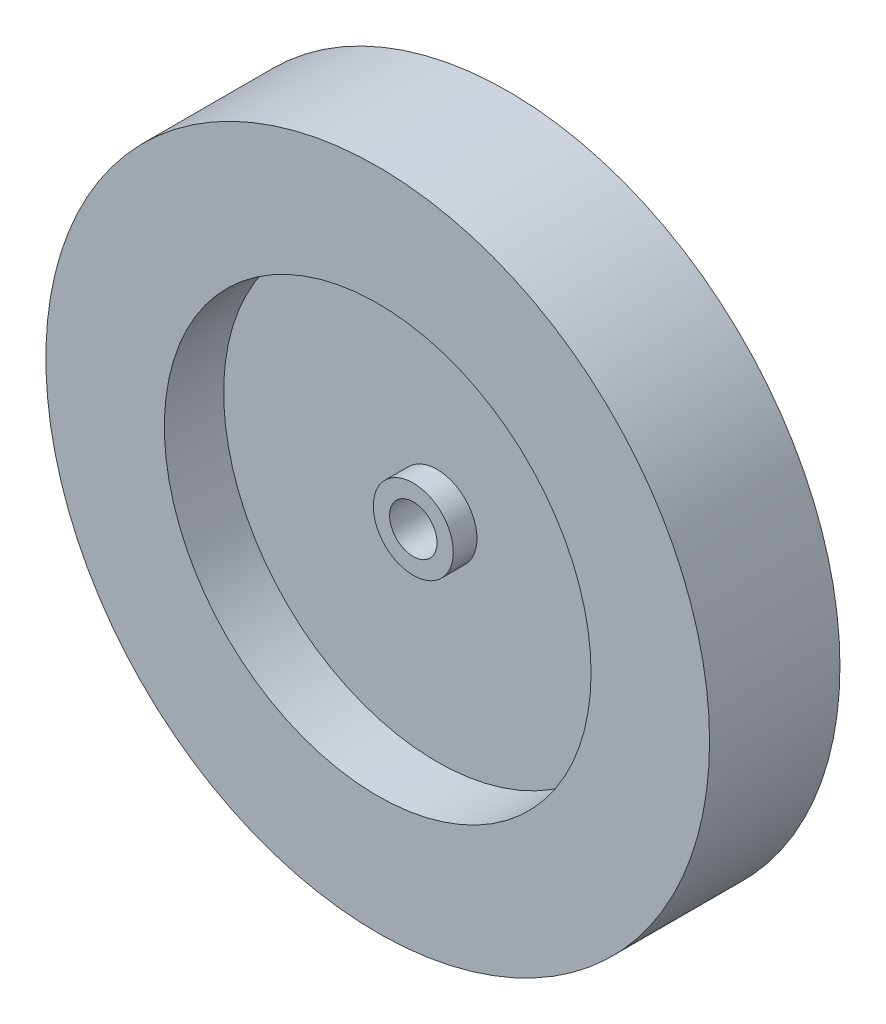
ISO-10303-21;
HEADER;
FILE_DESCRIPTION(('STEP AP214'),'2;1');
FILE_NAME('part.step','',(''),(''),'','','');
FILE_SCHEMA(('AUTOMOTIVE_DESIGN { 1 0 10303 214 1 1 1 1 }'));
ENDSEC;
DATA;
#1=APPLICATION_CONTEXT('core data for automotive mechanical design processes');
#2=APPLICATION_PROTOCOL_DEFINITION('international standard','automotive_design',2000,#1);
#3=PRODUCT_CONTEXT('',#1,'mechanical');
#4=PRODUCT('Part','Part','',(#3));
#5=PRODUCT_RELATED_PRODUCT_CATEGORY('part','',(#4));
#6=PRODUCT_DEFINITION_FORMATION('','',#4);
#7=PRODUCT_DEFINITION_CONTEXT('part definition',#1,'design');
#8=PRODUCT_DEFINITION('design','',#6,#7);
#9=PRODUCT_DEFINITION_SHAPE('','',#8);
#10=(LENGTH_UNIT() NAMED_UNIT(*) SI_UNIT(.MILLI.,.METRE.));
#11=(NAMED_UNIT(*) PLANE_ANGLE_UNIT() SI_UNIT($,.RADIAN.));
#12=(NAMED_UNIT(*) SI_UNIT($,.STERADIAN.) SOLID_ANGLE_UNIT());
#13=UNCERTAINTY_MEASURE_WITH_UNIT(LENGTH_MEASURE(1.E-05),#10,'distance_accuracy_value','');
#14=(GEOMETRIC_REPRESENTATION_CONTEXT(3) GLOBAL_UNCERTAINTY_ASSIGNED_CONTEXT((#13)) GLOBAL_UNIT_ASSIGNED_CONTEXT((#10,
#11,#12)) REPRESENTATION_CONTEXT('',''));
#15=CARTESIAN_POINT('',(0.,0.,0.));
#16=DIRECTION('',(0.,0.,1.));
#17=DIRECTION('',(1.,0.,0.));
#18=AXIS2_PLACEMENT_3D('',#15,#16,#17);
#19=CARTESIAN_POINT('',(0.,0.,1.5875));
#20=DIRECTION('',(0.,0.,1.));
#21=DIRECTION('',(1.,0.,0.));
#22=AXIS2_PLACEMENT_3D('',#19,#20,#21);
#23=PLANE('',#22);
#24=CARTESIAN_POINT('',(0.,0.,1.5875));
#25=DIRECTION('',(0.,0.,1.));
#26=DIRECTION('',(1.,0.,0.));
#27=AXIS2_PLACEMENT_3D('',#24,#25,#26);
#28=CIRCLE('',#27,10.715625);
#29=CARTESIAN_POINT('',(10.715625,0.,1.5875));
#30=VERTEX_POINT('',#29);
#31=EDGE_CURVE('E48',#30,#30,#28,.F.);
#32=ORIENTED_EDGE('',*,*,#31,.T.);
#33=EDGE_LOOP('',(#32));
#34=FACE_BOUND('',#33,.T.);
#35=CARTESIAN_POINT('',(0.,0.,1.5875));
#36=DIRECTION('',(0.,0.,1.));
#37=DIRECTION('',(1.,0.,0.));
#38=AXIS2_PLACEMENT_3D('',#35,#36,#37);
#39=CIRCLE('',#38,57.15);
#40=CARTESIAN_POINT('',(57.15,0.,1.5875));
#41=VERTEX_POINT('',#40);
#42=EDGE_CURVE('E10',#41,#41,#39,.F.);
#43=ORIENTED_EDGE('',*,*,#42,.F.);
#44=EDGE_LOOP('',(#43));
#45=FACE_BOUND('',#44,.T.);
#46=ADVANCED_FACE('F33',(#34,#45),#23,.T.);
#47=CARTESIAN_POINT('',(0.,0.,7.9375));
#48=DIRECTION('',(0.,0.,-1.));
#49=DIRECTION('',(-1.,0.,0.));
#50=AXIS2_PLACEMENT_3D('',#47,#48,#49);
#51=CYLINDRICAL_SURFACE('',#50,10.715625);
#52=ORIENTED_EDGE('',*,*,#31,.F.);
#53=EDGE_LOOP('',(#52));
#54=FACE_BOUND('',#53,.T.);
#55=CARTESIAN_POINT('',(0.,0.,7.9375));
#56=DIRECTION('',(0.,0.,1.));
#57=DIRECTION('',(1.,0.,0.));
#58=AXIS2_PLACEMENT_3D('',#55,#56,#57);
#59=CIRCLE('',#58,10.715625);
#60=CARTESIAN_POINT('',(10.715625,0.,7.9375));
#61=VERTEX_POINT('',#60);
#62=EDGE_CURVE('E51',#61,#61,#59,.T.);
#63=ORIENTED_EDGE('',*,*,#62,.F.);
#64=EDGE_LOOP('',(#63));
#65=FACE_BOUND('',#64,.T.);
#66=ADVANCED_FACE('F88',(#54,#65),#51,.T.);
#67=CARTESIAN_POINT('',(0.,0.,7.9375));
#68=DIRECTION('',(0.,0.,1.));
#69=DIRECTION('',(1.,0.,0.));
#70=AXIS2_PLACEMENT_3D('',#67,#68,#69);
#71=PLANE('',#70);
#72=CARTESIAN_POINT('',(0.,0.,7.9375));
#73=DIRECTION('',(0.,0.,1.));
#74=DIRECTION('',(1.,0.,0.));
#75=AXIS2_PLACEMENT_3D('',#72,#73,#74);
#76=CIRCLE('',#75,6.35);
#77=CARTESIAN_POINT('',(6.35,0.,7.9375));
#78=VERTEX_POINT('',#77);
#79=EDGE_CURVE('E68',#78,#78,#76,.T.);
#80=ORIENTED_EDGE('',*,*,#79,.F.);
#81=EDGE_LOOP('',(#80));
#82=FACE_BOUND('',#81,.T.);
#83=ORIENTED_EDGE('',*,*,#62,.T.);
#84=EDGE_LOOP('',(#83));
#85=FACE_BOUND('',#84,.T.);
#86=ADVANCED_FACE('F94',(#82,#85),#71,.T.);
#87=CARTESIAN_POINT('',(0.,0.,17.4625));
#88=DIRECTION('',(0.,0.,-1.));
#89=DIRECTION('',(-1.,0.,0.));
#90=AXIS2_PLACEMENT_3D('',#87,#88,#89);
#91=CYLINDRICAL_SURFACE('',#90,57.15);
#92=ORIENTED_EDGE('',*,*,#42,.T.);
#93=EDGE_LOOP('',(#92));
#94=FACE_BOUND('',#93,.T.);
#95=CARTESIAN_POINT('',(0.,0.,17.4625));
#96=DIRECTION('',(0.,0.,1.));
#97=DIRECTION('',(1.,0.,0.));
#98=AXIS2_PLACEMENT_3D('',#95,#96,#97);
#99=CIRCLE('',#98,57.15);
#100=CARTESIAN_POINT('',(57.15,0.,17.4625));
#101=VERTEX_POINT('',#100);
#102=EDGE_CURVE('E59',#101,#101,#99,.T.);
#103=ORIENTED_EDGE('',*,*,#102,.T.);
#104=EDGE_LOOP('',(#103));
#105=FACE_BOUND('',#104,.T.);
#106=ADVANCED_FACE('F110',(#94,#105),#91,.F.);
#107=CARTESIAN_POINT('',(0.,0.,-17.4625));
#108=DIRECTION('',(0.,0.,1.));
#109=DIRECTION('',(1.,0.,0.));
#110=AXIS2_PLACEMENT_3D('',#107,#108,#109);
#111=PLANE('',#110);
#112=CARTESIAN_POINT('',(0.,0.,-17.4625));
#113=DIRECTION('',(0.,0.,1.));
#114=DIRECTION('',(1.,0.,0.));
#115=AXIS2_PLACEMENT_3D('',#112,#113,#114);
#116=CIRCLE('',#115,88.9);
#117=CARTESIAN_POINT('',(88.9,0.,-17.4625));
#118=VERTEX_POINT('',#117);
#119=EDGE_CURVE('E45',#118,#118,#116,.T.);
#120=ORIENTED_EDGE('',*,*,#119,.F.);
#121=EDGE_LOOP('',(#120));
#122=FACE_BOUND('',#121,.T.);
#123=CARTESIAN_POINT('',(0.,0.,-17.4625));
#124=DIRECTION('',(0.,0.,1.));
#125=DIRECTION('',(1.,0.,0.));
#126=AXIS2_PLACEMENT_3D('',#123,#124,#125);
#127=CIRCLE('',#126,57.15);
#128=CARTESIAN_POINT('',(57.15,0.,-17.4625));
#129=VERTEX_POINT('',#128);
#130=EDGE_CURVE('E60',#129,#129,#127,.T.);
#131=ORIENTED_EDGE('',*,*,#130,.T.);
#132=EDGE_LOOP('',(#131));
#133=FACE_BOUND('',#132,.T.);
#134=ADVANCED_FACE('F108',(#122,#133),#111,.F.);
#135=CARTESIAN_POINT('',(0.,0.,17.4625));
#136=DIRECTION('',(0.,0.,-1.));
#137=DIRECTION('',(-1.,0.,0.));
#138=AXIS2_PLACEMENT_3D('',#135,#136,#137);
#139=CYLINDRICAL_SURFACE('',#138,88.9);
#140=CARTESIAN_POINT('',(0.,0.,17.4625));
#141=DIRECTION('',(0.,0.,1.));
#142=DIRECTION('',(1.,0.,0.));
#143=AXIS2_PLACEMENT_3D('',#140,#141,#142);
#144=CIRCLE('',#143,88.9);
#145=CARTESIAN_POINT('',(88.9,0.,17.4625));
#146=VERTEX_POINT('',#145);
#147=EDGE_CURVE('E41',#146,#146,#144,.T.);
#148=ORIENTED_EDGE('',*,*,#147,.F.);
#149=EDGE_LOOP('',(#148));
#150=FACE_BOUND('',#149,.T.);
#151=ORIENTED_EDGE('',*,*,#119,.T.);
#152=EDGE_LOOP('',(#151));
#153=FACE_BOUND('',#152,.T.);
#154=ADVANCED_FACE('F35',(#150,#153),#139,.T.);
#155=CARTESIAN_POINT('',(0.,0.,17.4625));
#156=DIRECTION('',(0.,0.,1.));
#157=DIRECTION('',(1.,0.,0.));
#158=AXIS2_PLACEMENT_3D('',#155,#156,#157);
#159=PLANE('',#158);
#160=ORIENTED_EDGE('',*,*,#147,.T.);
#161=EDGE_LOOP('',(#160));
#162=FACE_BOUND('',#161,.T.);
#163=ORIENTED_EDGE('',*,*,#102,.F.);
#164=EDGE_LOOP('',(#163));
#165=FACE_BOUND('',#164,.T.);
#166=ADVANCED_FACE('F105',(#162,#165),#159,.T.);
#167=ORIENTED_EDGE('',*,*,#130,.F.);
#168=EDGE_LOOP('',(#167));
#169=FACE_BOUND('',#168,.T.);
#170=CARTESIAN_POINT('',(0.,0.,-1.5875));
#171=DIRECTION('',(0.,0.,1.));
#172=DIRECTION('',(1.,0.,0.));
#173=AXIS2_PLACEMENT_3D('',#170,#171,#172);
#174=CIRCLE('',#173,57.15);
#175=CARTESIAN_POINT('',(57.15,0.,-1.5875));
#176=VERTEX_POINT('',#175);
#177=EDGE_CURVE('E56',#176,#176,#174,.F.);
#178=ORIENTED_EDGE('',*,*,#177,.F.);
#179=EDGE_LOOP('',(#178));
#180=FACE_BOUND('',#179,.T.);
#181=ADVANCED_FACE('F103',(#169,#180),#91,.F.);
#182=CARTESIAN_POINT('',(0.,0.,-1.5875));
#183=DIRECTION('',(0.,0.,1.));
#184=DIRECTION('',(1.,0.,0.));
#185=AXIS2_PLACEMENT_3D('',#182,#183,#184);
#186=PLANE('',#185);
#187=CARTESIAN_POINT('',(0.,0.,-1.5875));
#188=DIRECTION('',(0.,0.,1.));
#189=DIRECTION('',(1.,0.,0.));
#190=AXIS2_PLACEMENT_3D('',#187,#188,#189);
#191=CIRCLE('',#190,9.525);
#192=CARTESIAN_POINT('',(9.525,0.,-1.5875));
#193=VERTEX_POINT('',#192);
#194=EDGE_CURVE('E37',#193,#193,#191,.T.);
#195=ORIENTED_EDGE('',*,*,#194,.T.);
#196=EDGE_LOOP('',(#195));
#197=FACE_BOUND('',#196,.T.);
#198=ORIENTED_EDGE('',*,*,#177,.T.);
#199=EDGE_LOOP('',(#198));
#200=FACE_BOUND('',#199,.T.);
#201=ADVANCED_FACE('F100',(#197,#200),#186,.F.);
#202=CARTESIAN_POINT('',(0.,0.,-25.4));
#203=DIRECTION('',(0.,0.,1.));
#204=DIRECTION('',(1.,0.,0.));
#205=AXIS2_PLACEMENT_3D('',#202,#203,#204);
#206=CYLINDRICAL_SURFACE('',#205,9.525);
#207=CARTESIAN_POINT('',(0.,0.,-25.4));
#208=DIRECTION('',(0.,0.,1.));
#209=DIRECTION('',(1.,0.,0.));
#210=AXIS2_PLACEMENT_3D('',#207,#208,#209);
#211=CIRCLE('',#210,9.525);
#212=CARTESIAN_POINT('',(9.525,0.,-25.4));
#213=VERTEX_POINT('',#212);
#214=EDGE_CURVE('E65',#213,#213,#211,.T.);
#215=ORIENTED_EDGE('',*,*,#214,.T.);
#216=EDGE_LOOP('',(#215));
#217=FACE_BOUND('',#216,.T.);
#218=ORIENTED_EDGE('',*,*,#194,.F.);
#219=EDGE_LOOP('',(#218));
#220=FACE_BOUND('',#219,.T.);
#221=ADVANCED_FACE('F85',(#217,#220),#206,.T.);
#222=CARTESIAN_POINT('',(0.,0.,-25.4));
#223=DIRECTION('',(0.,0.,1.));
#224=DIRECTION('',(1.,0.,0.));
#225=AXIS2_PLACEMENT_3D('',#222,#223,#224);
#226=PLANE('',#225);
#227=CARTESIAN_POINT('',(0.,0.,-25.4));
#228=DIRECTION('',(0.,0.,1.));
#229=DIRECTION('',(1.,0.,0.));
#230=AXIS2_PLACEMENT_3D('',#227,#228,#229);
#231=CIRCLE('',#230,6.35);
#232=CARTESIAN_POINT('',(6.35,0.,-25.4));
#233=VERTEX_POINT('',#232);
#234=EDGE_CURVE('E71',#233,#233,#231,.T.);
#235=ORIENTED_EDGE('',*,*,#234,.T.);
#236=EDGE_LOOP('',(#235));
#237=FACE_BOUND('',#236,.T.);
#238=ORIENTED_EDGE('',*,*,#214,.F.);
#239=EDGE_LOOP('',(#238));
#240=FACE_BOUND('',#239,.T.);
#241=ADVANCED_FACE('F75',(#237,#240),#226,.F.);
#242=CARTESIAN_POINT('',(0.,0.,-25.4));
#243=DIRECTION('',(0.,0.,1.));
#244=DIRECTION('',(1.,0.,0.));
#245=AXIS2_PLACEMENT_3D('',#242,#243,#244);
#246=CYLINDRICAL_SURFACE('',#245,6.35);
#247=ORIENTED_EDGE('',*,*,#79,.T.);
#248=EDGE_LOOP('',(#247));
#249=FACE_BOUND('',#248,.T.);
#250=ORIENTED_EDGE('',*,*,#234,.F.);
#251=EDGE_LOOP('',(#250));
#252=FACE_BOUND('',#251,.T.);
#253=ADVANCED_FACE('F78',(#249,#252),#246,.F.);
#254=CLOSED_SHELL('',(#46,#66,#86,#106,#134,#154,#166,#181,#201,#221,#241,#253));
#255=MANIFOLD_SOLID_BREP('B2',#254);
#256=ADVANCED_BREP_SHAPE_REPRESENTATION('',(#18,#255),#14);
#257=SHAPE_DEFINITION_REPRESENTATION(#9,#256);
ENDSEC;
END-ISO-10303-21;
